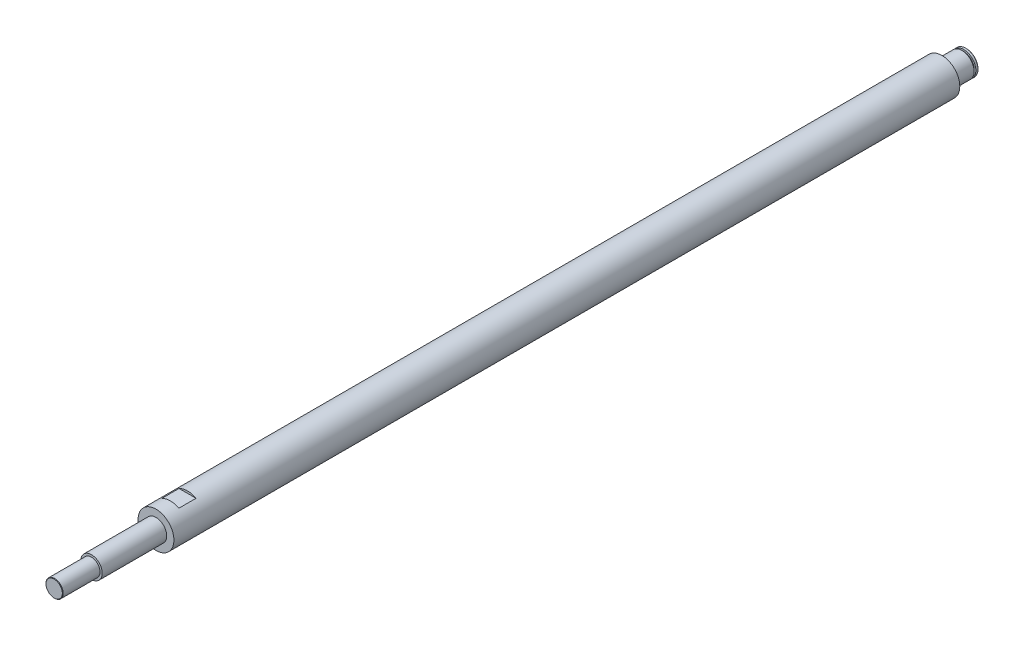
ISO-10303-21;
HEADER;
FILE_DESCRIPTION(('STEP AP214'),'2;1');
FILE_NAME('part.step','',(''),(''),'','','');
FILE_SCHEMA(('AUTOMOTIVE_DESIGN { 1 0 10303 214 1 1 1 1 }'));
ENDSEC;
DATA;
#1=APPLICATION_CONTEXT('core data for automotive mechanical design processes');
#2=APPLICATION_PROTOCOL_DEFINITION('international standard','automotive_design',2000,#1);
#3=PRODUCT_CONTEXT('',#1,'mechanical');
#4=PRODUCT('Part','Part','',(#3));
#5=PRODUCT_RELATED_PRODUCT_CATEGORY('part','',(#4));
#6=PRODUCT_DEFINITION_FORMATION('','',#4);
#7=PRODUCT_DEFINITION_CONTEXT('part definition',#1,'design');
#8=PRODUCT_DEFINITION('design','',#6,#7);
#9=PRODUCT_DEFINITION_SHAPE('','',#8);
#10=(LENGTH_UNIT() NAMED_UNIT(*) SI_UNIT(.MILLI.,.METRE.));
#11=(NAMED_UNIT(*) PLANE_ANGLE_UNIT() SI_UNIT($,.RADIAN.));
#12=(NAMED_UNIT(*) SI_UNIT($,.STERADIAN.) SOLID_ANGLE_UNIT());
#13=UNCERTAINTY_MEASURE_WITH_UNIT(LENGTH_MEASURE(1.E-05),#10,'distance_accuracy_value','');
#14=(GEOMETRIC_REPRESENTATION_CONTEXT(3) GLOBAL_UNCERTAINTY_ASSIGNED_CONTEXT((#13)) GLOBAL_UNIT_ASSIGNED_CONTEXT((#10,
#11,#12)) REPRESENTATION_CONTEXT('',''));
#15=CARTESIAN_POINT('',(0.,0.,0.));
#16=DIRECTION('',(0.,0.,1.));
#17=DIRECTION('',(1.,0.,0.));
#18=AXIS2_PLACEMENT_3D('',#15,#16,#17);
#19=CARTESIAN_POINT('',(0.,0.,610.));
#20=DIRECTION('',(0.,0.,1.));
#21=DIRECTION('',(1.,0.,0.));
#22=AXIS2_PLACEMENT_3D('',#19,#20,#21);
#23=PLANE('',#22);
#24=CARTESIAN_POINT('',(0.,0.,610.));
#25=DIRECTION('',(0.,0.,1.));
#26=DIRECTION('',(1.,0.,0.));
#27=AXIS2_PLACEMENT_3D('',#24,#25,#26);
#28=CIRCLE('',#27,7.5);
#29=CARTESIAN_POINT('',(7.5,0.,610.));
#30=VERTEX_POINT('',#29);
#31=EDGE_CURVE('E314',#30,#30,#28,.T.);
#32=ORIENTED_EDGE('',*,*,#31,.T.);
#33=EDGE_LOOP('',(#32));
#34=FACE_BOUND('',#33,.T.);
#35=CARTESIAN_POINT('',(0.,0.,610.));
#36=DIRECTION('',(0.,0.,1.));
#37=DIRECTION('',(1.,0.,0.));
#38=AXIS2_PLACEMENT_3D('',#35,#36,#37);
#39=CIRCLE('',#38,6.);
#40=CARTESIAN_POINT('',(6.,0.,610.));
#41=VERTEX_POINT('',#40);
#42=EDGE_CURVE('E310',#41,#41,#39,.T.);
#43=ORIENTED_EDGE('',*,*,#42,.F.);
#44=EDGE_LOOP('',(#43));
#45=FACE_BOUND('',#44,.T.);
#46=ADVANCED_FACE('F17',(#34,#45),#23,.T.);
#47=CARTESIAN_POINT('',(0.,0.,565.));
#48=DIRECTION('',(0.,0.,1.));
#49=DIRECTION('',(1.,0.,0.));
#50=AXIS2_PLACEMENT_3D('',#47,#48,#49);
#51=PLANE('',#50);
#52=CARTESIAN_POINT('',(0.,0.,565.));
#53=DIRECTION('',(0.,0.,1.));
#54=DIRECTION('',(1.,0.,0.));
#55=AXIS2_PLACEMENT_3D('',#52,#53,#54);
#56=CIRCLE('',#55,12.5);
#57=CARTESIAN_POINT('',(12.5,0.,565.));
#58=VERTEX_POINT('',#57);
#59=EDGE_CURVE('E319',#58,#58,#56,.T.);
#60=ORIENTED_EDGE('',*,*,#59,.T.);
#61=EDGE_LOOP('',(#60));
#62=FACE_BOUND('',#61,.T.);
#63=CARTESIAN_POINT('',(0.,0.,565.));
#64=DIRECTION('',(0.,0.,1.));
#65=DIRECTION('',(1.,0.,0.));
#66=AXIS2_PLACEMENT_3D('',#63,#64,#65);
#67=CIRCLE('',#66,7.5);
#68=CARTESIAN_POINT('',(7.5,0.,565.));
#69=VERTEX_POINT('',#68);
#70=EDGE_CURVE('E313',#69,#69,#67,.T.);
#71=ORIENTED_EDGE('',*,*,#70,.F.);
#72=EDGE_LOOP('',(#71));
#73=FACE_BOUND('',#72,.T.);
#74=ADVANCED_FACE('F101',(#62,#73),#51,.T.);
#75=CARTESIAN_POINT('',(0.,0.,1.8));
#76=DIRECTION('',(0.,0.,1.));
#77=DIRECTION('',(1.,0.,0.));
#78=AXIS2_PLACEMENT_3D('',#75,#76,#77);
#79=PLANE('',#78);
#80=CARTESIAN_POINT('',(0.,0.,1.8));
#81=DIRECTION('',(0.,0.,1.));
#82=DIRECTION('',(1.,0.,0.));
#83=AXIS2_PLACEMENT_3D('',#80,#81,#82);
#84=CIRCLE('',#83,8.5);
#85=CARTESIAN_POINT('',(8.5,0.,1.8));
#86=VERTEX_POINT('',#85);
#87=EDGE_CURVE('E334',#86,#86,#84,.T.);
#88=ORIENTED_EDGE('',*,*,#87,.T.);
#89=EDGE_LOOP('',(#88));
#90=FACE_BOUND('',#89,.T.);
#91=CARTESIAN_POINT('',(0.,0.,1.8));
#92=DIRECTION('',(0.,0.,1.));
#93=DIRECTION('',(1.,0.,0.));
#94=AXIS2_PLACEMENT_3D('',#91,#92,#93);
#95=CIRCLE('',#94,7.3);
#96=CARTESIAN_POINT('',(7.3,0.,1.8));
#97=VERTEX_POINT('',#96);
#98=EDGE_CURVE('E328',#97,#97,#95,.T.);
#99=ORIENTED_EDGE('',*,*,#98,.F.);
#100=EDGE_LOOP('',(#99));
#101=FACE_BOUND('',#100,.T.);
#102=ADVANCED_FACE('F107',(#90,#101),#79,.T.);
#103=CARTESIAN_POINT('',(0.,0.,1.8));
#104=DIRECTION('',(0.,0.,-1.));
#105=DIRECTION('',(-1.,0.,0.));
#106=AXIS2_PLACEMENT_3D('',#103,#104,#105);
#107=CYLINDRICAL_SURFACE('',#106,8.5);
#108=CARTESIAN_POINT('',(0.,0.,0.300000000000042));
#109=DIRECTION('',(0.,0.,1.));
#110=DIRECTION('',(1.,0.,0.));
#111=AXIS2_PLACEMENT_3D('',#108,#109,#110);
#112=CIRCLE('',#111,8.5);
#113=CARTESIAN_POINT('',(8.5,0.,0.300000000000042));
#114=VERTEX_POINT('',#113);
#115=EDGE_CURVE('E25',#114,#114,#112,.T.);
#116=ORIENTED_EDGE('',*,*,#115,.T.);
#117=EDGE_LOOP('',(#116));
#118=FACE_BOUND('',#117,.T.);
#119=ORIENTED_EDGE('',*,*,#87,.F.);
#120=EDGE_LOOP('',(#119));
#121=FACE_BOUND('',#120,.T.);
#122=ADVANCED_FACE('F88',(#118,#121),#107,.T.);
#123=CARTESIAN_POINT('',(0.,0.,0.));
#124=DIRECTION('',(0.,0.,1.));
#125=DIRECTION('',(1.,0.,0.));
#126=AXIS2_PLACEMENT_3D('',#123,#124,#125);
#127=PLANE('',#126);
#128=CARTESIAN_POINT('',(0.,0.,0.));
#129=DIRECTION('',(0.,0.,1.));
#130=DIRECTION('',(1.,0.,0.));
#131=AXIS2_PLACEMENT_3D('',#128,#129,#130);
#132=CIRCLE('',#131,8.2);
#133=CARTESIAN_POINT('',(8.2,0.,0.));
#134=VERTEX_POINT('',#133);
#135=EDGE_CURVE('E11',#134,#134,#132,.F.);
#136=ORIENTED_EDGE('',*,*,#135,.T.);
#137=EDGE_LOOP('',(#136));
#138=FACE_BOUND('',#137,.T.);
#139=ADVANCED_FACE('F137',(#138),#127,.F.);
#140=CARTESIAN_POINT('',(0.,0.,3.));
#141=DIRECTION('',(0.,0.,-1.));
#142=DIRECTION('',(-1.,0.,0.));
#143=AXIS2_PLACEMENT_3D('',#140,#141,#142);
#144=CYLINDRICAL_SURFACE('',#143,7.3);
#145=CARTESIAN_POINT('',(0.,0.,3.));
#146=DIRECTION('',(0.,0.,1.));
#147=DIRECTION('',(1.,0.,0.));
#148=AXIS2_PLACEMENT_3D('',#145,#146,#147);
#149=CIRCLE('',#148,7.3);
#150=CARTESIAN_POINT('',(7.3,0.,3.));
#151=VERTEX_POINT('',#150);
#152=EDGE_CURVE('E331',#151,#151,#149,.T.);
#153=ORIENTED_EDGE('',*,*,#152,.F.);
#154=EDGE_LOOP('',(#153));
#155=FACE_BOUND('',#154,.T.);
#156=ORIENTED_EDGE('',*,*,#98,.T.);
#157=EDGE_LOOP('',(#156));
#158=FACE_BOUND('',#157,.T.);
#159=ADVANCED_FACE('F130',(#155,#158),#144,.T.);
#160=CARTESIAN_POINT('',(0.,0.,3.));
#161=DIRECTION('',(0.,0.,1.));
#162=DIRECTION('',(1.,0.,0.));
#163=AXIS2_PLACEMENT_3D('',#160,#161,#162);
#164=PLANE('',#163);
#165=CARTESIAN_POINT('',(0.,0.,3.));
#166=DIRECTION('',(0.,0.,1.));
#167=DIRECTION('',(1.,0.,0.));
#168=AXIS2_PLACEMENT_3D('',#165,#166,#167);
#169=CIRCLE('',#168,8.5);
#170=CARTESIAN_POINT('',(8.5,0.,3.));
#171=VERTEX_POINT('',#170);
#172=EDGE_CURVE('E322',#171,#171,#169,.T.);
#173=ORIENTED_EDGE('',*,*,#172,.F.);
#174=EDGE_LOOP('',(#173));
#175=FACE_BOUND('',#174,.T.);
#176=ORIENTED_EDGE('',*,*,#152,.T.);
#177=EDGE_LOOP('',(#176));
#178=FACE_BOUND('',#177,.T.);
#179=ADVANCED_FACE('F127',(#175,#178),#164,.F.);
#180=CARTESIAN_POINT('',(0.,0.,17.));
#181=DIRECTION('',(0.,0.,-1.));
#182=DIRECTION('',(-1.,0.,0.));
#183=AXIS2_PLACEMENT_3D('',#180,#181,#182);
#184=CYLINDRICAL_SURFACE('',#183,8.5);
#185=CARTESIAN_POINT('',(0.,0.,17.));
#186=DIRECTION('',(0.,0.,1.));
#187=DIRECTION('',(1.,0.,0.));
#188=AXIS2_PLACEMENT_3D('',#185,#186,#187);
#189=CIRCLE('',#188,8.5);
#190=CARTESIAN_POINT('',(8.5,0.,17.));
#191=VERTEX_POINT('',#190);
#192=EDGE_CURVE('E325',#191,#191,#189,.T.);
#193=ORIENTED_EDGE('',*,*,#192,.F.);
#194=EDGE_LOOP('',(#193));
#195=FACE_BOUND('',#194,.T.);
#196=ORIENTED_EDGE('',*,*,#172,.T.);
#197=EDGE_LOOP('',(#196));
#198=FACE_BOUND('',#197,.T.);
#199=ADVANCED_FACE('F123',(#195,#198),#184,.T.);
#200=CARTESIAN_POINT('',(0.,0.,17.));
#201=DIRECTION('',(0.,0.,1.));
#202=DIRECTION('',(1.,0.,0.));
#203=AXIS2_PLACEMENT_3D('',#200,#201,#202);
#204=PLANE('',#203);
#205=CARTESIAN_POINT('',(0.,0.,17.));
#206=DIRECTION('',(0.,0.,1.));
#207=DIRECTION('',(1.,0.,0.));
#208=AXIS2_PLACEMENT_3D('',#205,#206,#207);
#209=CIRCLE('',#208,12.5);
#210=CARTESIAN_POINT('',(12.5,0.,17.));
#211=VERTEX_POINT('',#210);
#212=EDGE_CURVE('E316',#211,#211,#209,.T.);
#213=ORIENTED_EDGE('',*,*,#212,.F.);
#214=EDGE_LOOP('',(#213));
#215=FACE_BOUND('',#214,.T.);
#216=ORIENTED_EDGE('',*,*,#192,.T.);
#217=EDGE_LOOP('',(#216));
#218=FACE_BOUND('',#217,.T.);
#219=ADVANCED_FACE('F120',(#215,#218),#204,.F.);
#220=CARTESIAN_POINT('',(0.,0.,565.));
#221=DIRECTION('',(0.,0.,-1.));
#222=DIRECTION('',(-1.,0.,0.));
#223=AXIS2_PLACEMENT_3D('',#220,#221,#222);
#224=CYLINDRICAL_SURFACE('',#223,12.5);
#225=CARTESIAN_POINT('',(0.,0.,555.));
#226=DIRECTION('',(0.,0.,-1.));
#227=DIRECTION('',(-1.,0.,0.));
#228=AXIS2_PLACEMENT_3D('',#225,#226,#227);
#229=CIRCLE('',#228,12.5);
#230=CARTESIAN_POINT('',(-5.93717104351896,11.,555.));
#231=VERTEX_POINT('',#230);
#232=CARTESIAN_POINT('',(5.93717104351896,11.,555.));
#233=VERTEX_POINT('',#232);
#234=EDGE_CURVE('E69',#231,#233,#229,.T.);
#235=ORIENTED_EDGE('',*,*,#234,.F.);
#236=DIRECTION('',(0.,0.,-1.));
#237=VECTOR('',#236,1.);
#238=CARTESIAN_POINT('',(-5.93717104351896,11.,565.));
#239=LINE('',#238,#237);
#240=CARTESIAN_POINT('',(-5.93717104351896,11.,543.));
#241=VERTEX_POINT('',#240);
#242=EDGE_CURVE('E57',#231,#241,#239,.T.);
#243=ORIENTED_EDGE('',*,*,#242,.T.);
#244=CARTESIAN_POINT('',(0.,0.,543.));
#245=DIRECTION('',(0.,0.,1.));
#246=DIRECTION('',(1.,0.,0.));
#247=AXIS2_PLACEMENT_3D('',#244,#245,#246);
#248=CIRCLE('',#247,12.5);
#249=CARTESIAN_POINT('',(5.93717104351896,11.,543.));
#250=VERTEX_POINT('',#249);
#251=EDGE_CURVE('E65',#250,#241,#248,.T.);
#252=ORIENTED_EDGE('',*,*,#251,.F.);
#253=DIRECTION('',(0.,0.,-1.));
#254=VECTOR('',#253,1.);
#255=CARTESIAN_POINT('',(5.93717104351896,11.,565.));
#256=LINE('',#255,#254);
#257=EDGE_CURVE('E74',#250,#233,#256,.F.);
#258=ORIENTED_EDGE('',*,*,#257,.T.);
#259=EDGE_LOOP('',(#235,#243,#252,#258));
#260=FACE_BOUND('',#259,.T.);
#261=CARTESIAN_POINT('',(0.,0.,555.));
#262=DIRECTION('',(0.,0.,1.));
#263=DIRECTION('',(1.,0.,0.));
#264=AXIS2_PLACEMENT_3D('',#261,#262,#263);
#265=CIRCLE('',#264,12.5);
#266=CARTESIAN_POINT('',(-5.93717104351896,-11.,555.));
#267=VERTEX_POINT('',#266);
#268=CARTESIAN_POINT('',(5.93717104351896,-11.,555.));
#269=VERTEX_POINT('',#268);
#270=EDGE_CURVE('E345',#267,#269,#265,.T.);
#271=ORIENTED_EDGE('',*,*,#270,.T.);
#272=DIRECTION('',(0.,0.,-1.));
#273=VECTOR('',#272,1.);
#274=CARTESIAN_POINT('',(5.93717104351896,-11.,565.));
#275=LINE('',#274,#273);
#276=CARTESIAN_POINT('',(5.93717104351896,-11.,543.));
#277=VERTEX_POINT('',#276);
#278=EDGE_CURVE('E77',#269,#277,#275,.T.);
#279=ORIENTED_EDGE('',*,*,#278,.T.);
#280=CARTESIAN_POINT('',(0.,0.,543.));
#281=DIRECTION('',(0.,0.,-1.));
#282=DIRECTION('',(-1.,0.,0.));
#283=AXIS2_PLACEMENT_3D('',#280,#281,#282);
#284=CIRCLE('',#283,12.5);
#285=CARTESIAN_POINT('',(-5.93717104351896,-11.,543.));
#286=VERTEX_POINT('',#285);
#287=EDGE_CURVE('E342',#277,#286,#284,.T.);
#288=ORIENTED_EDGE('',*,*,#287,.T.);
#289=DIRECTION('',(0.,0.,-1.));
#290=VECTOR('',#289,1.);
#291=CARTESIAN_POINT('',(-5.93717104351896,-11.,565.));
#292=LINE('',#291,#290);
#293=EDGE_CURVE('E339',#286,#267,#292,.F.);
#294=ORIENTED_EDGE('',*,*,#293,.T.);
#295=EDGE_LOOP('',(#271,#279,#288,#294));
#296=FACE_BOUND('',#295,.T.);
#297=ORIENTED_EDGE('',*,*,#59,.F.);
#298=EDGE_LOOP('',(#297));
#299=FACE_BOUND('',#298,.T.);
#300=ORIENTED_EDGE('',*,*,#212,.T.);
#301=EDGE_LOOP('',(#300));
#302=FACE_BOUND('',#301,.T.);
#303=ADVANCED_FACE('F72',(#260,#296,#299,#302),#224,.T.);
#304=CARTESIAN_POINT('',(0.,0.,610.));
#305=DIRECTION('',(0.,0.,-1.));
#306=DIRECTION('',(-1.,0.,0.));
#307=AXIS2_PLACEMENT_3D('',#304,#305,#306);
#308=CYLINDRICAL_SURFACE('',#307,7.5);
#309=ORIENTED_EDGE('',*,*,#31,.F.);
#310=EDGE_LOOP('',(#309));
#311=FACE_BOUND('',#310,.T.);
#312=ORIENTED_EDGE('',*,*,#70,.T.);
#313=EDGE_LOOP('',(#312));
#314=FACE_BOUND('',#313,.T.);
#315=ADVANCED_FACE('F116',(#311,#314),#308,.T.);
#316=CARTESIAN_POINT('',(0.,0.,636.));
#317=DIRECTION('',(0.,0.,-1.));
#318=DIRECTION('',(-1.,0.,0.));
#319=AXIS2_PLACEMENT_3D('',#316,#317,#318);
#320=CYLINDRICAL_SURFACE('',#319,6.);
#321=CARTESIAN_POINT('',(0.,0.,635.7));
#322=DIRECTION('',(0.,0.,1.));
#323=DIRECTION('',(1.,0.,0.));
#324=AXIS2_PLACEMENT_3D('',#321,#322,#323);
#325=CIRCLE('',#324,6.);
#326=CARTESIAN_POINT('',(6.,0.,635.7));
#327=VERTEX_POINT('',#326);
#328=EDGE_CURVE('E83',#327,#327,#325,.F.);
#329=ORIENTED_EDGE('',*,*,#328,.T.);
#330=EDGE_LOOP('',(#329));
#331=FACE_BOUND('',#330,.T.);
#332=ORIENTED_EDGE('',*,*,#42,.T.);
#333=EDGE_LOOP('',(#332));
#334=FACE_BOUND('',#333,.T.);
#335=ADVANCED_FACE('F114',(#331,#334),#320,.T.);
#336=CARTESIAN_POINT('',(0.,0.,636.));
#337=DIRECTION('',(0.,0.,1.));
#338=DIRECTION('',(1.,0.,0.));
#339=AXIS2_PLACEMENT_3D('',#336,#337,#338);
#340=PLANE('',#339);
#341=CARTESIAN_POINT('',(0.,0.,636.));
#342=DIRECTION('',(0.,0.,1.));
#343=DIRECTION('',(1.,0.,0.));
#344=AXIS2_PLACEMENT_3D('',#341,#342,#343);
#345=CIRCLE('',#344,5.70000000000026);
#346=CARTESIAN_POINT('',(5.70000000000026,0.,636.));
#347=VERTEX_POINT('',#346);
#348=EDGE_CURVE('E64',#347,#347,#345,.T.);
#349=ORIENTED_EDGE('',*,*,#348,.T.);
#350=EDGE_LOOP('',(#349));
#351=FACE_BOUND('',#350,.T.);
#352=ADVANCED_FACE('F194',(#351),#340,.T.);
#353=CARTESIAN_POINT('',(-20.,-23.,555.));
#354=DIRECTION('',(0.,0.,1.));
#355=DIRECTION('',(1.,0.,0.));
#356=AXIS2_PLACEMENT_3D('',#353,#354,#355);
#357=PLANE('',#356);
#358=DIRECTION('',(1.,0.,0.));
#359=VECTOR('',#358,1.);
#360=CARTESIAN_POINT('',(-20.,-11.,555.));
#361=LINE('',#360,#359);
#362=EDGE_CURVE('E40',#267,#269,#361,.T.);
#363=ORIENTED_EDGE('',*,*,#362,.T.);
#364=ORIENTED_EDGE('',*,*,#270,.F.);
#365=EDGE_LOOP('',(#363,#364));
#366=FACE_BOUND('',#365,.T.);
#367=ADVANCED_FACE('F202',(#366),#357,.F.);
#368=CARTESIAN_POINT('',(-20.,-23.,543.));
#369=DIRECTION('',(0.,0.,-1.));
#370=DIRECTION('',(-1.,0.,0.));
#371=AXIS2_PLACEMENT_3D('',#368,#369,#370);
#372=PLANE('',#371);
#373=DIRECTION('',(-1.,0.,0.));
#374=VECTOR('',#373,1.);
#375=CARTESIAN_POINT('',(-20.,-11.,543.));
#376=LINE('',#375,#374);
#377=EDGE_CURVE('E304',#277,#286,#376,.T.);
#378=ORIENTED_EDGE('',*,*,#377,.T.);
#379=ORIENTED_EDGE('',*,*,#287,.F.);
#380=EDGE_LOOP('',(#378,#379));
#381=FACE_BOUND('',#380,.T.);
#382=ADVANCED_FACE('F210',(#381),#372,.F.);
#383=CARTESIAN_POINT('',(0.,-11.,0.));
#384=DIRECTION('',(0.,1.,0.));
#385=DIRECTION('',(0.,0.,1.));
#386=AXIS2_PLACEMENT_3D('',#383,#384,#385);
#387=PLANE('',#386);
#388=ORIENTED_EDGE('',*,*,#362,.F.);
#389=ORIENTED_EDGE('',*,*,#293,.F.);
#390=ORIENTED_EDGE('',*,*,#377,.F.);
#391=ORIENTED_EDGE('',*,*,#278,.F.);
#392=EDGE_LOOP('',(#388,#389,#390,#391));
#393=FACE_BOUND('',#392,.T.);
#394=ADVANCED_FACE('F219',(#393),#387,.F.);
#395=CARTESIAN_POINT('',(-20.,23.,543.));
#396=DIRECTION('',(0.,0.,1.));
#397=DIRECTION('',(1.,0.,0.));
#398=AXIS2_PLACEMENT_3D('',#395,#396,#397);
#399=PLANE('',#398);
#400=ORIENTED_EDGE('',*,*,#251,.T.);
#401=DIRECTION('',(-1.,0.,0.));
#402=VECTOR('',#401,1.);
#403=CARTESIAN_POINT('',(-20.,11.,543.));
#404=LINE('',#403,#402);
#405=EDGE_CURVE('E60',#250,#241,#404,.T.);
#406=ORIENTED_EDGE('',*,*,#405,.F.);
#407=EDGE_LOOP('',(#400,#406));
#408=FACE_BOUND('',#407,.T.);
#409=ADVANCED_FACE('F228',(#408),#399,.T.);
#410=CARTESIAN_POINT('',(-20.,23.,555.));
#411=DIRECTION('',(0.,0.,-1.));
#412=DIRECTION('',(-1.,0.,0.));
#413=AXIS2_PLACEMENT_3D('',#410,#411,#412);
#414=PLANE('',#413);
#415=ORIENTED_EDGE('',*,*,#234,.T.);
#416=DIRECTION('',(1.,0.,0.));
#417=VECTOR('',#416,1.);
#418=CARTESIAN_POINT('',(-20.,11.,555.));
#419=LINE('',#418,#417);
#420=EDGE_CURVE('E32',#231,#233,#419,.T.);
#421=ORIENTED_EDGE('',*,*,#420,.F.);
#422=EDGE_LOOP('',(#415,#421));
#423=FACE_BOUND('',#422,.T.);
#424=ADVANCED_FACE('F68',(#423),#414,.T.);
#425=CARTESIAN_POINT('',(0.,11.,0.));
#426=DIRECTION('',(0.,-1.,0.));
#427=DIRECTION('',(0.,0.,1.));
#428=AXIS2_PLACEMENT_3D('',#425,#426,#427);
#429=PLANE('',#428);
#430=ORIENTED_EDGE('',*,*,#420,.T.);
#431=ORIENTED_EDGE('',*,*,#257,.F.);
#432=ORIENTED_EDGE('',*,*,#405,.T.);
#433=ORIENTED_EDGE('',*,*,#242,.F.);
#434=EDGE_LOOP('',(#430,#431,#432,#433));
#435=FACE_BOUND('',#434,.T.);
#436=ADVANCED_FACE('F58',(#435),#429,.F.);
#437=CARTESIAN_POINT('',(0.,0.,636.));
#438=DIRECTION('',(0.,0.,-1.));
#439=DIRECTION('',(-1.,0.,0.));
#440=AXIS2_PLACEMENT_3D('',#437,#438,#439);
#441=CONICAL_SURFACE('',#440,5.70000000000026,0.785398163397443);
#442=ORIENTED_EDGE('',*,*,#328,.F.);
#443=EDGE_LOOP('',(#442));
#444=FACE_BOUND('',#443,.T.);
#445=ORIENTED_EDGE('',*,*,#348,.F.);
#446=EDGE_LOOP('',(#445));
#447=FACE_BOUND('',#446,.T.);
#448=ADVANCED_FACE('F92',(#444,#447),#441,.T.);
#449=CARTESIAN_POINT('',(0.,0.,0.300000000000042));
#450=DIRECTION('',(0.,0.,1.));
#451=DIRECTION('',(1.,0.,0.));
#452=AXIS2_PLACEMENT_3D('',#449,#450,#451);
#453=CONICAL_SURFACE('',#452,8.5,0.785398163397497);
#454=ORIENTED_EDGE('',*,*,#135,.F.);
#455=EDGE_LOOP('',(#454));
#456=FACE_BOUND('',#455,.T.);
#457=ORIENTED_EDGE('',*,*,#115,.F.);
#458=EDGE_LOOP('',(#457));
#459=FACE_BOUND('',#458,.T.);
#460=ADVANCED_FACE('F19',(#456,#459),#453,.T.);
#461=CLOSED_SHELL('',(#46,#74,#102,#122,#139,#159,#179,#199,#219,#303,#315,#335,#352,#367,#382,
#394,#409,#424,#436,#448,#460));
#462=MANIFOLD_SOLID_BREP('B1',#461);
#463=ADVANCED_BREP_SHAPE_REPRESENTATION('',(#18,#462),#14);
#464=SHAPE_DEFINITION_REPRESENTATION(#9,#463);
ENDSEC;
END-ISO-10303-21;
